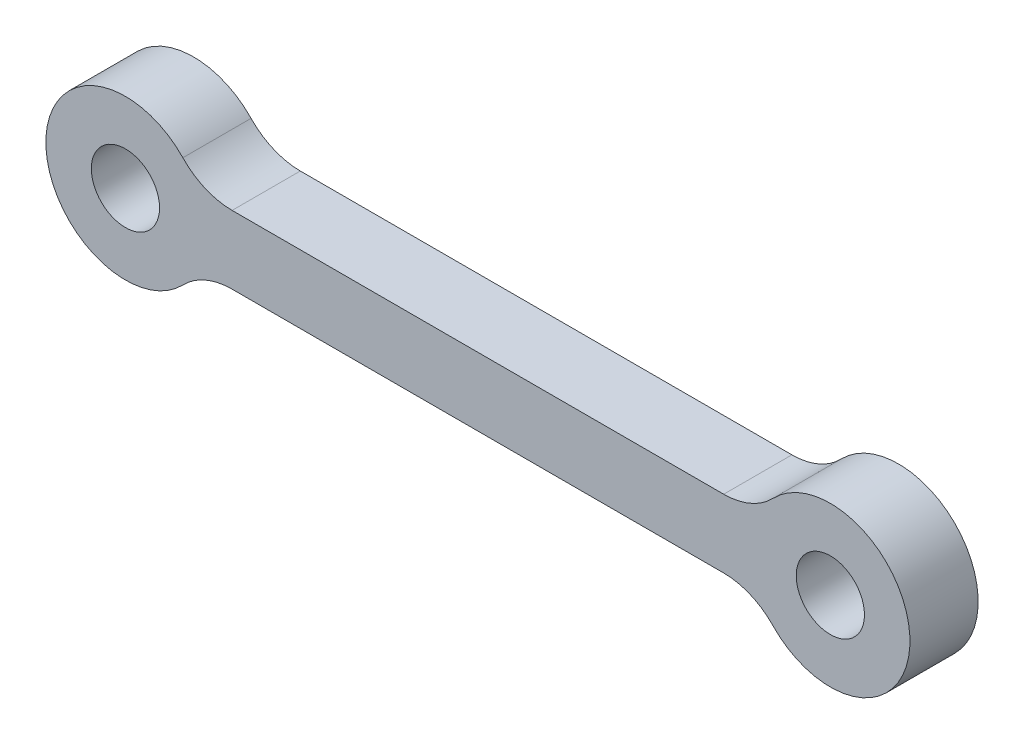
ISO-10303-21;
HEADER;
FILE_DESCRIPTION(('STEP AP214'),'2;1');
FILE_NAME('part.step','',(''),(''),'','','');
FILE_SCHEMA(('AUTOMOTIVE_DESIGN { 1 0 10303 214 1 1 1 1 }'));
ENDSEC;
DATA;
#1=APPLICATION_CONTEXT('core data for automotive mechanical design processes');
#2=APPLICATION_PROTOCOL_DEFINITION('international standard','automotive_design',2000,#1);
#3=PRODUCT_CONTEXT('',#1,'mechanical');
#4=PRODUCT('Part','Part','',(#3));
#5=PRODUCT_RELATED_PRODUCT_CATEGORY('part','',(#4));
#6=PRODUCT_DEFINITION_FORMATION('','',#4);
#7=PRODUCT_DEFINITION_CONTEXT('part definition',#1,'design');
#8=PRODUCT_DEFINITION('design','',#6,#7);
#9=PRODUCT_DEFINITION_SHAPE('','',#8);
#10=(LENGTH_UNIT() NAMED_UNIT(*) SI_UNIT(.MILLI.,.METRE.));
#11=(NAMED_UNIT(*) PLANE_ANGLE_UNIT() SI_UNIT($,.RADIAN.));
#12=(NAMED_UNIT(*) SI_UNIT($,.STERADIAN.) SOLID_ANGLE_UNIT());
#13=UNCERTAINTY_MEASURE_WITH_UNIT(LENGTH_MEASURE(1.E-05),#10,'distance_accuracy_value','');
#14=(GEOMETRIC_REPRESENTATION_CONTEXT(3) GLOBAL_UNCERTAINTY_ASSIGNED_CONTEXT((#13)) GLOBAL_UNIT_ASSIGNED_CONTEXT((#10,
#11,#12)) REPRESENTATION_CONTEXT('',''));
#15=CARTESIAN_POINT('',(0.,0.,0.));
#16=DIRECTION('',(0.,0.,1.));
#17=DIRECTION('',(1.,0.,0.));
#18=AXIS2_PLACEMENT_3D('',#15,#16,#17);
#19=CARTESIAN_POINT('',(0.,0.,3.));
#20=DIRECTION('',(0.,0.,-1.));
#21=DIRECTION('',(-1.,0.,0.));
#22=AXIS2_PLACEMENT_3D('',#19,#20,#21);
#23=CYLINDRICAL_SURFACE('',#22,3.5);
#24=CARTESIAN_POINT('',(0.,0.,0.));
#25=DIRECTION('',(0.,0.,1.));
#26=DIRECTION('',(1.,0.,0.));
#27=AXIS2_PLACEMENT_3D('',#24,#25,#26);
#28=CIRCLE('',#27,3.5);
#29=CARTESIAN_POINT('',(2.52560848605877,2.42307692307692,0.));
#30=VERTEX_POINT('',#29);
#31=CARTESIAN_POINT('',(2.52560848605877,-2.42307692307692,0.));
#32=VERTEX_POINT('',#31);
#33=EDGE_CURVE('E139',#30,#32,#28,.T.);
#34=ORIENTED_EDGE('',*,*,#33,.T.);
#35=DIRECTION('',(0.,0.,-1.));
#36=VECTOR('',#35,1.);
#37=CARTESIAN_POINT('',(2.52560848605877,-2.42307692307692,3.));
#38=LINE('',#37,#36);
#39=CARTESIAN_POINT('',(2.52560848605877,-2.42307692307692,3.));
#40=VERTEX_POINT('',#39);
#41=EDGE_CURVE('E154',#32,#40,#38,.F.);
#42=ORIENTED_EDGE('',*,*,#41,.T.);
#43=CARTESIAN_POINT('',(0.,0.,3.));
#44=DIRECTION('',(0.,0.,1.));
#45=DIRECTION('',(1.,0.,0.));
#46=AXIS2_PLACEMENT_3D('',#43,#44,#45);
#47=CIRCLE('',#46,3.5);
#48=CARTESIAN_POINT('',(2.52560848605877,2.42307692307692,3.));
#49=VERTEX_POINT('',#48);
#50=EDGE_CURVE('E175',#49,#40,#47,.T.);
#51=ORIENTED_EDGE('',*,*,#50,.F.);
#52=DIRECTION('',(0.,0.,-1.));
#53=VECTOR('',#52,1.);
#54=CARTESIAN_POINT('',(2.52560848605877,2.42307692307692,3.));
#55=LINE('',#54,#53);
#56=EDGE_CURVE('E151',#49,#30,#55,.T.);
#57=ORIENTED_EDGE('',*,*,#56,.T.);
#58=EDGE_LOOP('',(#34,#42,#51,#57));
#59=FACE_BOUND('',#58,.T.);
#60=ADVANCED_FACE('F40',(#59),#23,.T.);
#61=CARTESIAN_POINT('',(0.,-1.5,3.));
#62=DIRECTION('',(0.,1.,0.));
#63=DIRECTION('',(0.,0.,1.));
#64=AXIS2_PLACEMENT_3D('',#61,#62,#63);
#65=PLANE('',#64);
#66=DIRECTION('',(1.,0.,0.));
#67=VECTOR('',#66,1.);
#68=CARTESIAN_POINT('',(0.,-1.5,0.));
#69=LINE('',#68,#67);
#70=CARTESIAN_POINT('',(4.69041575982343,-1.5,0.));
#71=VERTEX_POINT('',#70);
#72=CARTESIAN_POINT('',(26.3095842401766,-1.5,0.));
#73=VERTEX_POINT('',#72);
#74=EDGE_CURVE('E135',#71,#73,#69,.T.);
#75=ORIENTED_EDGE('',*,*,#74,.T.);
#76=DIRECTION('',(0.,0.,1.));
#77=VECTOR('',#76,1.);
#78=CARTESIAN_POINT('',(26.3095842401766,-1.5,3.));
#79=LINE('',#78,#77);
#80=CARTESIAN_POINT('',(26.3095842401766,-1.5,3.));
#81=VERTEX_POINT('',#80);
#82=EDGE_CURVE('E111',#73,#81,#79,.T.);
#83=ORIENTED_EDGE('',*,*,#82,.T.);
#84=DIRECTION('',(1.,0.,0.));
#85=VECTOR('',#84,1.);
#86=CARTESIAN_POINT('',(0.,-1.5,3.));
#87=LINE('',#86,#85);
#88=CARTESIAN_POINT('',(4.69041575982343,-1.5,3.));
#89=VERTEX_POINT('',#88);
#90=EDGE_CURVE('E180',#89,#81,#87,.T.);
#91=ORIENTED_EDGE('',*,*,#90,.F.);
#92=DIRECTION('',(0.,0.,1.));
#93=VECTOR('',#92,1.);
#94=CARTESIAN_POINT('',(4.69041575982343,-1.5,0.));
#95=LINE('',#94,#93);
#96=EDGE_CURVE('E126',#89,#71,#95,.F.);
#97=ORIENTED_EDGE('',*,*,#96,.T.);
#98=EDGE_LOOP('',(#75,#83,#91,#97));
#99=FACE_BOUND('',#98,.T.);
#100=ADVANCED_FACE('F198',(#99),#65,.F.);
#101=CARTESIAN_POINT('',(31.,0.,3.));
#102=DIRECTION('',(0.,0.,-1.));
#103=DIRECTION('',(-1.,0.,0.));
#104=AXIS2_PLACEMENT_3D('',#101,#102,#103);
#105=CYLINDRICAL_SURFACE('',#104,3.5);
#106=CARTESIAN_POINT('',(31.,0.,3.));
#107=DIRECTION('',(0.,0.,1.));
#108=DIRECTION('',(1.,0.,0.));
#109=AXIS2_PLACEMENT_3D('',#106,#107,#108);
#110=CIRCLE('',#109,3.5);
#111=CARTESIAN_POINT('',(28.4743915139413,-2.42307692307692,3.));
#112=VERTEX_POINT('',#111);
#113=CARTESIAN_POINT('',(28.4743915139413,2.42307692307692,3.));
#114=VERTEX_POINT('',#113);
#115=EDGE_CURVE('E125',#112,#114,#110,.T.);
#116=ORIENTED_EDGE('',*,*,#115,.F.);
#117=DIRECTION('',(0.,0.,-1.));
#118=VECTOR('',#117,1.);
#119=CARTESIAN_POINT('',(28.4743915139413,-2.42307692307692,3.));
#120=LINE('',#119,#118);
#121=CARTESIAN_POINT('',(28.4743915139413,-2.42307692307692,0.));
#122=VERTEX_POINT('',#121);
#123=EDGE_CURVE('E110',#112,#122,#120,.T.);
#124=ORIENTED_EDGE('',*,*,#123,.T.);
#125=CARTESIAN_POINT('',(31.,0.,0.));
#126=DIRECTION('',(0.,0.,1.));
#127=DIRECTION('',(1.,0.,0.));
#128=AXIS2_PLACEMENT_3D('',#125,#126,#127);
#129=CIRCLE('',#128,3.5);
#130=CARTESIAN_POINT('',(28.4743915139413,2.42307692307692,0.));
#131=VERTEX_POINT('',#130);
#132=EDGE_CURVE('E123',#122,#131,#129,.T.);
#133=ORIENTED_EDGE('',*,*,#132,.T.);
#134=DIRECTION('',(0.,0.,-1.));
#135=VECTOR('',#134,1.);
#136=CARTESIAN_POINT('',(28.4743915139413,2.42307692307692,3.));
#137=LINE('',#136,#135);
#138=EDGE_CURVE('E127',#131,#114,#137,.F.);
#139=ORIENTED_EDGE('',*,*,#138,.T.);
#140=EDGE_LOOP('',(#116,#124,#133,#139));
#141=FACE_BOUND('',#140,.T.);
#142=ADVANCED_FACE('F122',(#141),#105,.T.);
#143=CARTESIAN_POINT('',(0.,1.5,3.));
#144=DIRECTION('',(0.,1.,0.));
#145=DIRECTION('',(0.,0.,1.));
#146=AXIS2_PLACEMENT_3D('',#143,#144,#145);
#147=PLANE('',#146);
#148=DIRECTION('',(1.,0.,0.));
#149=VECTOR('',#148,1.);
#150=CARTESIAN_POINT('',(0.,1.5,3.));
#151=LINE('',#150,#149);
#152=CARTESIAN_POINT('',(4.69041575982344,1.5,3.));
#153=VERTEX_POINT('',#152);
#154=CARTESIAN_POINT('',(26.3095842401766,1.5,3.));
#155=VERTEX_POINT('',#154);
#156=EDGE_CURVE('E177',#153,#155,#151,.T.);
#157=ORIENTED_EDGE('',*,*,#156,.T.);
#158=DIRECTION('',(0.,0.,-1.));
#159=VECTOR('',#158,1.);
#160=CARTESIAN_POINT('',(26.3095842401766,1.5,3.));
#161=LINE('',#160,#159);
#162=CARTESIAN_POINT('',(26.3095842401766,1.5,0.));
#163=VERTEX_POINT('',#162);
#164=EDGE_CURVE('E117',#155,#163,#161,.T.);
#165=ORIENTED_EDGE('',*,*,#164,.T.);
#166=DIRECTION('',(1.,0.,0.));
#167=VECTOR('',#166,1.);
#168=CARTESIAN_POINT('',(0.,1.5,0.));
#169=LINE('',#168,#167);
#170=CARTESIAN_POINT('',(4.69041575982344,1.5,0.));
#171=VERTEX_POINT('',#170);
#172=EDGE_CURVE('E134',#171,#163,#169,.T.);
#173=ORIENTED_EDGE('',*,*,#172,.F.);
#174=DIRECTION('',(0.,0.,-1.));
#175=VECTOR('',#174,1.);
#176=CARTESIAN_POINT('',(4.69041575982344,1.5,3.));
#177=LINE('',#176,#175);
#178=EDGE_CURVE('E62',#171,#153,#177,.F.);
#179=ORIENTED_EDGE('',*,*,#178,.T.);
#180=EDGE_LOOP('',(#157,#165,#173,#179));
#181=FACE_BOUND('',#180,.T.);
#182=ADVANCED_FACE('F168',(#181),#147,.T.);
#183=CARTESIAN_POINT('',(0.,0.,3.));
#184=DIRECTION('',(0.,0.,-1.));
#185=DIRECTION('',(-1.,0.,0.));
#186=AXIS2_PLACEMENT_3D('',#183,#184,#185);
#187=CYLINDRICAL_SURFACE('',#186,1.5);
#188=CARTESIAN_POINT('',(0.,0.,3.));
#189=DIRECTION('',(0.,0.,1.));
#190=DIRECTION('',(1.,0.,0.));
#191=AXIS2_PLACEMENT_3D('',#188,#189,#190);
#192=CIRCLE('',#191,1.5);
#193=CARTESIAN_POINT('',(1.5,0.,3.));
#194=VERTEX_POINT('',#193);
#195=EDGE_CURVE('E145',#194,#194,#192,.T.);
#196=ORIENTED_EDGE('',*,*,#195,.T.);
#197=EDGE_LOOP('',(#196));
#198=FACE_BOUND('',#197,.T.);
#199=CARTESIAN_POINT('',(0.,0.,0.));
#200=DIRECTION('',(0.,0.,1.));
#201=DIRECTION('',(1.,0.,0.));
#202=AXIS2_PLACEMENT_3D('',#199,#200,#201);
#203=CIRCLE('',#202,1.5);
#204=CARTESIAN_POINT('',(1.5,0.,0.));
#205=VERTEX_POINT('',#204);
#206=EDGE_CURVE('E191',#205,#205,#203,.T.);
#207=ORIENTED_EDGE('',*,*,#206,.F.);
#208=EDGE_LOOP('',(#207));
#209=FACE_BOUND('',#208,.T.);
#210=ADVANCED_FACE('F209',(#198,#209),#187,.F.);
#211=CARTESIAN_POINT('',(31.,0.,3.));
#212=DIRECTION('',(0.,0.,-1.));
#213=DIRECTION('',(-1.,0.,0.));
#214=AXIS2_PLACEMENT_3D('',#211,#212,#213);
#215=CYLINDRICAL_SURFACE('',#214,1.5);
#216=CARTESIAN_POINT('',(31.,0.,3.));
#217=DIRECTION('',(0.,0.,1.));
#218=DIRECTION('',(1.,0.,0.));
#219=AXIS2_PLACEMENT_3D('',#216,#217,#218);
#220=CIRCLE('',#219,1.5);
#221=CARTESIAN_POINT('',(32.5,0.,3.));
#222=VERTEX_POINT('',#221);
#223=EDGE_CURVE('E146',#222,#222,#220,.T.);
#224=ORIENTED_EDGE('',*,*,#223,.T.);
#225=EDGE_LOOP('',(#224));
#226=FACE_BOUND('',#225,.T.);
#227=CARTESIAN_POINT('',(31.,0.,0.));
#228=DIRECTION('',(0.,0.,1.));
#229=DIRECTION('',(1.,0.,0.));
#230=AXIS2_PLACEMENT_3D('',#227,#228,#229);
#231=CIRCLE('',#230,1.5);
#232=CARTESIAN_POINT('',(32.5,0.,0.));
#233=VERTEX_POINT('',#232);
#234=EDGE_CURVE('E137',#233,#233,#231,.T.);
#235=ORIENTED_EDGE('',*,*,#234,.F.);
#236=EDGE_LOOP('',(#235));
#237=FACE_BOUND('',#236,.T.);
#238=ADVANCED_FACE('F212',(#226,#237),#215,.F.);
#239=CARTESIAN_POINT('',(0.,0.,3.));
#240=DIRECTION('',(0.,0.,1.));
#241=DIRECTION('',(1.,0.,0.));
#242=AXIS2_PLACEMENT_3D('',#239,#240,#241);
#243=PLANE('',#242);
#244=ORIENTED_EDGE('',*,*,#195,.F.);
#245=EDGE_LOOP('',(#244));
#246=FACE_BOUND('',#245,.T.);
#247=ORIENTED_EDGE('',*,*,#156,.F.);
#248=CARTESIAN_POINT('',(4.69041575982344,4.5,3.));
#249=DIRECTION('',(0.,0.,1.));
#250=DIRECTION('',(1.,0.,0.));
#251=AXIS2_PLACEMENT_3D('',#248,#249,#250);
#252=CIRCLE('',#251,3.);
#253=EDGE_CURVE('E12',#153,#49,#252,.F.);
#254=ORIENTED_EDGE('',*,*,#253,.T.);
#255=ORIENTED_EDGE('',*,*,#50,.T.);
#256=CARTESIAN_POINT('',(4.69041575982343,-4.5,3.));
#257=DIRECTION('',(0.,0.,1.));
#258=DIRECTION('',(1.,0.,0.));
#259=AXIS2_PLACEMENT_3D('',#256,#257,#258);
#260=CIRCLE('',#259,3.);
#261=EDGE_CURVE('E162',#40,#89,#260,.F.);
#262=ORIENTED_EDGE('',*,*,#261,.T.);
#263=ORIENTED_EDGE('',*,*,#90,.T.);
#264=CARTESIAN_POINT('',(26.3095842401766,-4.5,3.));
#265=DIRECTION('',(0.,0.,1.));
#266=DIRECTION('',(1.,0.,0.));
#267=AXIS2_PLACEMENT_3D('',#264,#265,#266);
#268=CIRCLE('',#267,3.);
#269=EDGE_CURVE('E116',#81,#112,#268,.F.);
#270=ORIENTED_EDGE('',*,*,#269,.T.);
#271=ORIENTED_EDGE('',*,*,#115,.T.);
#272=CARTESIAN_POINT('',(26.3095842401766,4.5,3.));
#273=DIRECTION('',(0.,0.,1.));
#274=DIRECTION('',(1.,0.,0.));
#275=AXIS2_PLACEMENT_3D('',#272,#273,#274);
#276=CIRCLE('',#275,3.);
#277=EDGE_CURVE('E55',#114,#155,#276,.F.);
#278=ORIENTED_EDGE('',*,*,#277,.T.);
#279=EDGE_LOOP('',(#247,#254,#255,#262,#263,#270,#271,#278));
#280=FACE_BOUND('',#279,.T.);
#281=ORIENTED_EDGE('',*,*,#223,.F.);
#282=EDGE_LOOP('',(#281));
#283=FACE_BOUND('',#282,.T.);
#284=ADVANCED_FACE('F173',(#246,#280,#283),#243,.T.);
#285=CARTESIAN_POINT('',(0.,0.,0.));
#286=DIRECTION('',(0.,0.,1.));
#287=DIRECTION('',(1.,0.,0.));
#288=AXIS2_PLACEMENT_3D('',#285,#286,#287);
#289=PLANE('',#288);
#290=ORIENTED_EDGE('',*,*,#206,.T.);
#291=EDGE_LOOP('',(#290));
#292=FACE_BOUND('',#291,.T.);
#293=ORIENTED_EDGE('',*,*,#33,.F.);
#294=CARTESIAN_POINT('',(4.69041575982344,4.5,0.));
#295=DIRECTION('',(0.,0.,1.));
#296=DIRECTION('',(1.,0.,0.));
#297=AXIS2_PLACEMENT_3D('',#294,#295,#296);
#298=CIRCLE('',#297,3.);
#299=EDGE_CURVE('E48',#30,#171,#298,.T.);
#300=ORIENTED_EDGE('',*,*,#299,.T.);
#301=ORIENTED_EDGE('',*,*,#172,.T.);
#302=CARTESIAN_POINT('',(26.3095842401766,4.5,0.));
#303=DIRECTION('',(0.,0.,1.));
#304=DIRECTION('',(1.,0.,0.));
#305=AXIS2_PLACEMENT_3D('',#302,#303,#304);
#306=CIRCLE('',#305,3.);
#307=EDGE_CURVE('E133',#163,#131,#306,.T.);
#308=ORIENTED_EDGE('',*,*,#307,.T.);
#309=ORIENTED_EDGE('',*,*,#132,.F.);
#310=CARTESIAN_POINT('',(26.3095842401766,-4.5,0.));
#311=DIRECTION('',(0.,0.,1.));
#312=DIRECTION('',(1.,0.,0.));
#313=AXIS2_PLACEMENT_3D('',#310,#311,#312);
#314=CIRCLE('',#313,3.);
#315=EDGE_CURVE('E106',#122,#73,#314,.T.);
#316=ORIENTED_EDGE('',*,*,#315,.T.);
#317=ORIENTED_EDGE('',*,*,#74,.F.);
#318=CARTESIAN_POINT('',(4.69041575982343,-4.5,0.));
#319=DIRECTION('',(0.,0.,1.));
#320=DIRECTION('',(1.,0.,0.));
#321=AXIS2_PLACEMENT_3D('',#318,#319,#320);
#322=CIRCLE('',#321,3.);
#323=EDGE_CURVE('E160',#71,#32,#322,.T.);
#324=ORIENTED_EDGE('',*,*,#323,.T.);
#325=EDGE_LOOP('',(#293,#300,#301,#308,#309,#316,#317,#324));
#326=FACE_BOUND('',#325,.T.);
#327=ORIENTED_EDGE('',*,*,#234,.T.);
#328=EDGE_LOOP('',(#327));
#329=FACE_BOUND('',#328,.T.);
#330=ADVANCED_FACE('F130',(#292,#326,#329),#289,.F.);
#331=CARTESIAN_POINT('',(26.3095842401766,-4.5,3.));
#332=DIRECTION('',(0.,0.,-1.));
#333=DIRECTION('',(-1.,0.,0.));
#334=AXIS2_PLACEMENT_3D('',#331,#332,#333);
#335=CYLINDRICAL_SURFACE('',#334,3.);
#336=ORIENTED_EDGE('',*,*,#269,.F.);
#337=ORIENTED_EDGE('',*,*,#82,.F.);
#338=ORIENTED_EDGE('',*,*,#315,.F.);
#339=ORIENTED_EDGE('',*,*,#123,.F.);
#340=EDGE_LOOP('',(#336,#337,#338,#339));
#341=FACE_BOUND('',#340,.T.);
#342=ADVANCED_FACE('F109',(#341),#335,.F.);
#343=CARTESIAN_POINT('',(4.69041575982343,-4.5,3.));
#344=DIRECTION('',(0.,0.,-1.));
#345=DIRECTION('',(-1.,0.,0.));
#346=AXIS2_PLACEMENT_3D('',#343,#344,#345);
#347=CYLINDRICAL_SURFACE('',#346,3.);
#348=ORIENTED_EDGE('',*,*,#261,.F.);
#349=ORIENTED_EDGE('',*,*,#41,.F.);
#350=ORIENTED_EDGE('',*,*,#323,.F.);
#351=ORIENTED_EDGE('',*,*,#96,.F.);
#352=EDGE_LOOP('',(#348,#349,#350,#351));
#353=FACE_BOUND('',#352,.T.);
#354=ADVANCED_FACE('F194',(#353),#347,.F.);
#355=CARTESIAN_POINT('',(26.3095842401766,4.5,3.));
#356=DIRECTION('',(0.,0.,-1.));
#357=DIRECTION('',(-1.,0.,0.));
#358=AXIS2_PLACEMENT_3D('',#355,#356,#357);
#359=CYLINDRICAL_SURFACE('',#358,3.);
#360=ORIENTED_EDGE('',*,*,#277,.F.);
#361=ORIENTED_EDGE('',*,*,#138,.F.);
#362=ORIENTED_EDGE('',*,*,#307,.F.);
#363=ORIENTED_EDGE('',*,*,#164,.F.);
#364=EDGE_LOOP('',(#360,#361,#362,#363));
#365=FACE_BOUND('',#364,.T.);
#366=ADVANCED_FACE('F217',(#365),#359,.F.);
#367=CARTESIAN_POINT('',(4.69041575982344,4.5,3.));
#368=DIRECTION('',(0.,0.,-1.));
#369=DIRECTION('',(-1.,0.,0.));
#370=AXIS2_PLACEMENT_3D('',#367,#368,#369);
#371=CYLINDRICAL_SURFACE('',#370,3.);
#372=ORIENTED_EDGE('',*,*,#253,.F.);
#373=ORIENTED_EDGE('',*,*,#178,.F.);
#374=ORIENTED_EDGE('',*,*,#299,.F.);
#375=ORIENTED_EDGE('',*,*,#56,.F.);
#376=EDGE_LOOP('',(#372,#373,#374,#375));
#377=FACE_BOUND('',#376,.T.);
#378=ADVANCED_FACE('F42',(#377),#371,.F.);
#379=CLOSED_SHELL('',(#60,#100,#142,#182,#210,#238,#284,#330,#342,#354,#366,#378));
#380=MANIFOLD_SOLID_BREP('B2',#379);
#381=ADVANCED_BREP_SHAPE_REPRESENTATION('',(#18,#380),#14);
#382=SHAPE_DEFINITION_REPRESENTATION(#9,#381);
ENDSEC;
END-ISO-10303-21;
